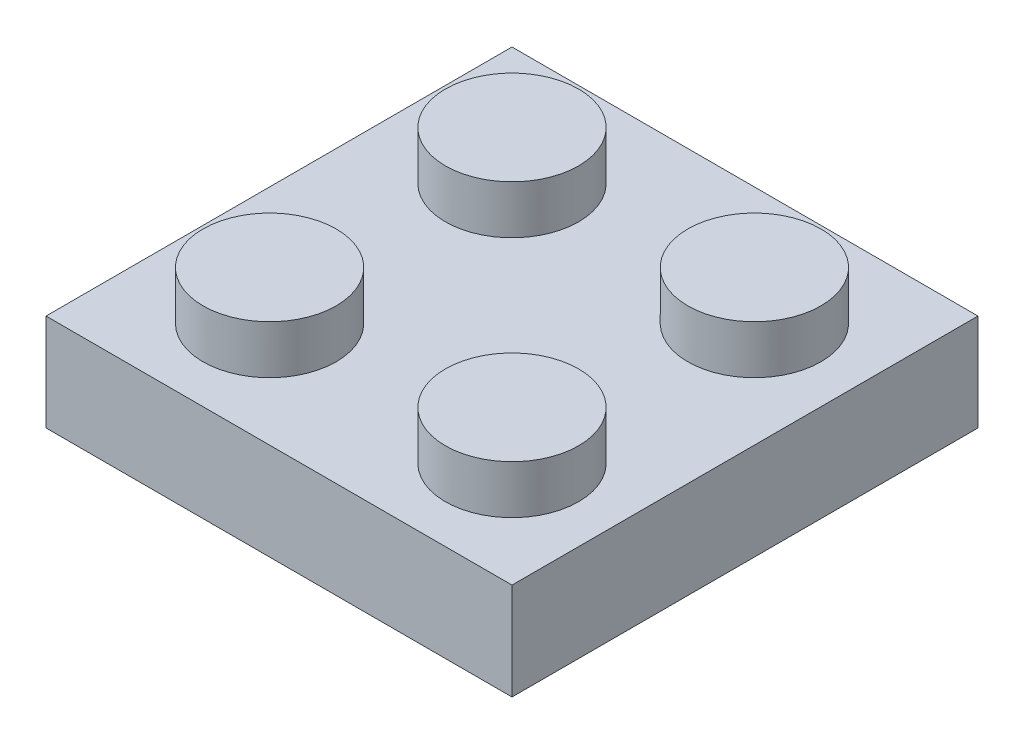
ISO-10303-21;
HEADER;
FILE_DESCRIPTION(('STEP AP214'),'2;1');
FILE_NAME('part.step','',(''),(''),'','','');
FILE_SCHEMA(('AUTOMOTIVE_DESIGN { 1 0 10303 214 1 1 1 1 }'));
ENDSEC;
DATA;
#1=APPLICATION_CONTEXT('core data for automotive mechanical design processes');
#2=APPLICATION_PROTOCOL_DEFINITION('international standard','automotive_design',2000,#1);
#3=PRODUCT_CONTEXT('',#1,'mechanical');
#4=PRODUCT('Part','Part','',(#3));
#5=PRODUCT_RELATED_PRODUCT_CATEGORY('part','',(#4));
#6=PRODUCT_DEFINITION_FORMATION('','',#4);
#7=PRODUCT_DEFINITION_CONTEXT('part definition',#1,'design');
#8=PRODUCT_DEFINITION('design','',#6,#7);
#9=PRODUCT_DEFINITION_SHAPE('','',#8);
#10=(LENGTH_UNIT() NAMED_UNIT(*) SI_UNIT(.MILLI.,.METRE.));
#11=(NAMED_UNIT(*) PLANE_ANGLE_UNIT() SI_UNIT($,.RADIAN.));
#12=(NAMED_UNIT(*) SI_UNIT($,.STERADIAN.) SOLID_ANGLE_UNIT());
#13=UNCERTAINTY_MEASURE_WITH_UNIT(LENGTH_MEASURE(1.E-05),#10,'distance_accuracy_value','');
#14=(GEOMETRIC_REPRESENTATION_CONTEXT(3) GLOBAL_UNCERTAINTY_ASSIGNED_CONTEXT((#13)) GLOBAL_UNIT_ASSIGNED_CONTEXT((#10,
#11,#12)) REPRESENTATION_CONTEXT('',''));
#15=CARTESIAN_POINT('',(0.,0.,0.));
#16=DIRECTION('',(0.,0.,1.));
#17=DIRECTION('',(1.,0.,0.));
#18=AXIS2_PLACEMENT_3D('',#15,#16,#17);
#19=CARTESIAN_POINT('',(-4.79472906403941,-9.19238815542512,0.));
#20=DIRECTION('',(0.,1.,0.));
#21=DIRECTION('',(-1.,0.,0.));
#22=AXIS2_PLACEMENT_3D('',#19,#20,#21);
#23=CYLINDRICAL_SURFACE('',#22,3.25);
#24=CARTESIAN_POINT('',(-4.79472906403941,2.,0.));
#25=DIRECTION('',(0.,-1.,0.));
#26=DIRECTION('',(1.,0.,0.));
#27=AXIS2_PLACEMENT_3D('',#24,#25,#26);
#28=CIRCLE('',#27,3.25);
#29=CARTESIAN_POINT('',(-3.5985824304441,2.,-3.02187578019656));
#30=VERTEX_POINT('',#29);
#31=CARTESIAN_POINT('',(-7.81660484423598,2.,1.19614663359531));
#32=VERTEX_POINT('',#31);
#33=EDGE_CURVE('E214',#30,#32,#28,.T.);
#34=ORIENTED_EDGE('',*,*,#33,.T.);
#35=DIRECTION('',(0.,1.,0.));
#36=VECTOR('',#35,1.);
#37=CARTESIAN_POINT('',(-7.81660484423598,1.1,1.19614663359531));
#38=LINE('',#37,#36);
#39=CARTESIAN_POINT('',(-7.81660484423598,0.2,1.19614663359531));
#40=VERTEX_POINT('',#39);
#41=EDGE_CURVE('E411',#40,#32,#38,.T.);
#42=ORIENTED_EDGE('',*,*,#41,.F.);
#43=CARTESIAN_POINT('',(-4.79472906403941,0.200000000000001,0.));
#44=DIRECTION('',(0.,1.,0.));
#45=DIRECTION('',(0.,0.,1.));
#46=AXIS2_PLACEMENT_3D('',#43,#44,#45);
#47=CIRCLE('',#46,3.25);
#48=CARTESIAN_POINT('',(-3.5985824304441,0.2,-3.02187578019656));
#49=VERTEX_POINT('',#48);
#50=EDGE_CURVE('E171',#40,#49,#47,.T.);
#51=ORIENTED_EDGE('',*,*,#50,.T.);
#52=DIRECTION('',(0.,1.,0.));
#53=VECTOR('',#52,1.);
#54=CARTESIAN_POINT('',(-3.5985824304441,1.1,-3.02187578019657));
#55=LINE('',#54,#53);
#56=EDGE_CURVE('E190',#30,#49,#55,.F.);
#57=ORIENTED_EDGE('',*,*,#56,.F.);
#58=EDGE_LOOP('',(#34,#42,#51,#57));
#59=FACE_BOUND('',#58,.T.);
#60=ADVANCED_FACE('F53',(#59),#23,.T.);
#61=CARTESIAN_POINT('',(-12.4847290640394,0.,7.69));
#62=DIRECTION('',(0.,1.,0.));
#63=DIRECTION('',(0.,0.,1.));
#64=AXIS2_PLACEMENT_3D('',#61,#62,#63);
#65=PLANE('',#64);
#66=DIRECTION('',(1.,0.,0.));
#67=VECTOR('',#66,1.);
#68=CARTESIAN_POINT('',(-12.4847290640394,0.,-7.69));
#69=LINE('',#68,#67);
#70=CARTESIAN_POINT('',(-12.4847290640394,0.,-7.69));
#71=VERTEX_POINT('',#70);
#72=CARTESIAN_POINT('',(2.89527093596059,0.,-7.69));
#73=VERTEX_POINT('',#72);
#74=EDGE_CURVE('E296',#71,#73,#69,.T.);
#75=ORIENTED_EDGE('',*,*,#74,.T.);
#76=DIRECTION('',(0.,0.,-1.));
#77=VECTOR('',#76,1.);
#78=CARTESIAN_POINT('',(2.89527093596059,0.,7.69));
#79=LINE('',#78,#77);
#80=CARTESIAN_POINT('',(2.89527093596059,0.,7.69));
#81=VERTEX_POINT('',#80);
#82=EDGE_CURVE('E306',#81,#73,#79,.T.);
#83=ORIENTED_EDGE('',*,*,#82,.F.);
#84=DIRECTION('',(1.,0.,0.));
#85=VECTOR('',#84,1.);
#86=CARTESIAN_POINT('',(-12.4847290640394,0.,7.69));
#87=LINE('',#86,#85);
#88=CARTESIAN_POINT('',(-12.4847290640394,0.,7.69));
#89=VERTEX_POINT('',#88);
#90=EDGE_CURVE('E286',#89,#81,#87,.T.);
#91=ORIENTED_EDGE('',*,*,#90,.F.);
#92=DIRECTION('',(0.,0.,-1.));
#93=VECTOR('',#92,1.);
#94=CARTESIAN_POINT('',(-12.4847290640394,0.,7.69));
#95=LINE('',#94,#93);
#96=EDGE_CURVE('E309',#89,#71,#95,.T.);
#97=ORIENTED_EDGE('',*,*,#96,.T.);
#98=EDGE_LOOP('',(#75,#83,#91,#97));
#99=FACE_BOUND('',#98,.T.);
#100=DIRECTION('',(1.,0.,0.));
#101=VECTOR('',#100,1.);
#102=CARTESIAN_POINT('',(-12.4847290640394,0.,-6.49));
#103=LINE('',#102,#101);
#104=CARTESIAN_POINT('',(-11.2847290640394,0.,-6.49));
#105=VERTEX_POINT('',#104);
#106=CARTESIAN_POINT('',(1.69527093596059,0.,-6.49));
#107=VERTEX_POINT('',#106);
#108=EDGE_CURVE('E261',#105,#107,#103,.T.);
#109=ORIENTED_EDGE('',*,*,#108,.F.);
#110=DIRECTION('',(0.,0.,-1.));
#111=VECTOR('',#110,1.);
#112=CARTESIAN_POINT('',(-11.2847290640394,0.,7.69));
#113=LINE('',#112,#111);
#114=CARTESIAN_POINT('',(-11.2847290640394,0.,6.49));
#115=VERTEX_POINT('',#114);
#116=EDGE_CURVE('E239',#115,#105,#113,.T.);
#117=ORIENTED_EDGE('',*,*,#116,.F.);
#118=DIRECTION('',(1.,0.,0.));
#119=VECTOR('',#118,1.);
#120=CARTESIAN_POINT('',(-12.4847290640394,0.,6.49));
#121=LINE('',#120,#119);
#122=CARTESIAN_POINT('',(1.69527093596059,0.,6.49));
#123=VERTEX_POINT('',#122);
#124=EDGE_CURVE('E264',#115,#123,#121,.T.);
#125=ORIENTED_EDGE('',*,*,#124,.T.);
#126=DIRECTION('',(0.,0.,-1.));
#127=VECTOR('',#126,1.);
#128=CARTESIAN_POINT('',(1.69527093596059,0.,7.69));
#129=LINE('',#128,#127);
#130=EDGE_CURVE('E253',#123,#107,#129,.T.);
#131=ORIENTED_EDGE('',*,*,#130,.T.);
#132=EDGE_LOOP('',(#109,#117,#125,#131));
#133=FACE_BOUND('',#132,.T.);
#134=ADVANCED_FACE('F358',(#99,#133),#65,.F.);
#135=CARTESIAN_POINT('',(-0.584729064039415,4.8,4.21));
#136=DIRECTION('',(0.,1.,0.));
#137=DIRECTION('',(-1.,0.,0.));
#138=AXIS2_PLACEMENT_3D('',#135,#136,#137);
#139=PLANE('',#138);
#140=CARTESIAN_POINT('',(-0.584729064039415,4.8,4.21));
#141=DIRECTION('',(0.,1.,0.));
#142=DIRECTION('',(-1.,0.,0.));
#143=AXIS2_PLACEMENT_3D('',#140,#141,#142);
#144=CIRCLE('',#143,2.19793866498286);
#145=CARTESIAN_POINT('',(-2.78266772902228,4.8,4.21));
#146=VERTEX_POINT('',#145);
#147=EDGE_CURVE('E61',#146,#146,#144,.T.);
#148=ORIENTED_EDGE('',*,*,#147,.T.);
#149=EDGE_LOOP('',(#148));
#150=FACE_BOUND('',#149,.T.);
#151=ADVANCED_FACE('F55',(#150),#139,.T.);
#152=CARTESIAN_POINT('',(-0.584729064039415,4.8,4.21));
#153=DIRECTION('',(0.,-1.,0.));
#154=DIRECTION('',(1.,0.,0.));
#155=AXIS2_PLACEMENT_3D('',#152,#153,#154);
#156=CYLINDRICAL_SURFACE('',#155,2.19793866498286);
#157=ORIENTED_EDGE('',*,*,#147,.F.);
#158=EDGE_LOOP('',(#157));
#159=FACE_BOUND('',#158,.T.);
#160=CARTESIAN_POINT('',(-0.584729064039415,3.2,4.21));
#161=DIRECTION('',(0.,-1.,0.));
#162=DIRECTION('',(1.,0.,0.));
#163=AXIS2_PLACEMENT_3D('',#160,#161,#162);
#164=CIRCLE('',#163,2.19793866498286);
#165=CARTESIAN_POINT('',(1.61320960094345,3.2,4.21));
#166=VERTEX_POINT('',#165);
#167=EDGE_CURVE('E324',#166,#166,#164,.F.);
#168=ORIENTED_EDGE('',*,*,#167,.T.);
#169=EDGE_LOOP('',(#168));
#170=FACE_BOUND('',#169,.T.);
#171=ADVANCED_FACE('F330',(#159,#170),#156,.T.);
#172=CARTESIAN_POINT('',(-8.58472906403941,4.8,4.21));
#173=DIRECTION('',(0.,1.,0.));
#174=DIRECTION('',(-1.,0.,0.));
#175=AXIS2_PLACEMENT_3D('',#172,#173,#174);
#176=PLANE('',#175);
#177=CARTESIAN_POINT('',(-8.58472906403941,4.8,4.21));
#178=DIRECTION('',(0.,1.,0.));
#179=DIRECTION('',(-1.,0.,0.));
#180=AXIS2_PLACEMENT_3D('',#177,#178,#179);
#181=CIRCLE('',#180,2.19793866498286);
#182=CARTESIAN_POINT('',(-10.7826677290223,4.8,4.21));
#183=VERTEX_POINT('',#182);
#184=EDGE_CURVE('E321',#183,#183,#181,.T.);
#185=ORIENTED_EDGE('',*,*,#184,.T.);
#186=EDGE_LOOP('',(#185));
#187=FACE_BOUND('',#186,.T.);
#188=ADVANCED_FACE('F333',(#187),#176,.T.);
#189=CARTESIAN_POINT('',(-8.58472906403941,4.8,4.21));
#190=DIRECTION('',(0.,-1.,0.));
#191=DIRECTION('',(1.,0.,0.));
#192=AXIS2_PLACEMENT_3D('',#189,#190,#191);
#193=CYLINDRICAL_SURFACE('',#192,2.19793866498286);
#194=ORIENTED_EDGE('',*,*,#184,.F.);
#195=EDGE_LOOP('',(#194));
#196=FACE_BOUND('',#195,.T.);
#197=CARTESIAN_POINT('',(-8.58472906403941,3.2,4.21));
#198=DIRECTION('',(0.,-1.,0.));
#199=DIRECTION('',(1.,0.,0.));
#200=AXIS2_PLACEMENT_3D('',#197,#198,#199);
#201=CIRCLE('',#200,2.19793866498286);
#202=CARTESIAN_POINT('',(-6.38679039905655,3.2,4.21));
#203=VERTEX_POINT('',#202);
#204=EDGE_CURVE('E318',#203,#203,#201,.F.);
#205=ORIENTED_EDGE('',*,*,#204,.T.);
#206=EDGE_LOOP('',(#205));
#207=FACE_BOUND('',#206,.T.);
#208=ADVANCED_FACE('F762',(#196,#207),#193,.T.);
#209=CARTESIAN_POINT('',(-12.4847290640394,3.2,7.69));
#210=DIRECTION('',(1.,0.,0.));
#211=DIRECTION('',(0.,0.,-1.));
#212=AXIS2_PLACEMENT_3D('',#209,#210,#211);
#213=PLANE('',#212);
#214=DIRECTION('',(0.,-1.,0.));
#215=VECTOR('',#214,1.);
#216=CARTESIAN_POINT('',(-12.4847290640394,3.2,-7.69));
#217=LINE('',#216,#215);
#218=CARTESIAN_POINT('',(-12.4847290640394,3.2,-7.69));
#219=VERTEX_POINT('',#218);
#220=EDGE_CURVE('E282',#219,#71,#217,.T.);
#221=ORIENTED_EDGE('',*,*,#220,.T.);
#222=ORIENTED_EDGE('',*,*,#96,.F.);
#223=DIRECTION('',(0.,-1.,0.));
#224=VECTOR('',#223,1.);
#225=CARTESIAN_POINT('',(-12.4847290640394,3.2,7.69));
#226=LINE('',#225,#224);
#227=CARTESIAN_POINT('',(-12.4847290640394,3.2,7.69));
#228=VERTEX_POINT('',#227);
#229=EDGE_CURVE('E283',#228,#89,#226,.T.);
#230=ORIENTED_EDGE('',*,*,#229,.F.);
#231=DIRECTION('',(0.,0.,-1.));
#232=VECTOR('',#231,1.);
#233=CARTESIAN_POINT('',(-12.4847290640394,3.2,7.69));
#234=LINE('',#233,#232);
#235=EDGE_CURVE('E293',#228,#219,#234,.T.);
#236=ORIENTED_EDGE('',*,*,#235,.T.);
#237=EDGE_LOOP('',(#221,#222,#230,#236));
#238=FACE_BOUND('',#237,.T.);
#239=ADVANCED_FACE('F351',(#238),#213,.F.);
#240=CARTESIAN_POINT('',(2.89527093596059,0.,7.69));
#241=DIRECTION('',(-1.,0.,0.));
#242=DIRECTION('',(0.,0.,1.));
#243=AXIS2_PLACEMENT_3D('',#240,#241,#242);
#244=PLANE('',#243);
#245=DIRECTION('',(0.,1.,0.));
#246=VECTOR('',#245,1.);
#247=CARTESIAN_POINT('',(2.89527093596059,0.,-7.69));
#248=LINE('',#247,#246);
#249=CARTESIAN_POINT('',(2.89527093596059,3.2,-7.69));
#250=VERTEX_POINT('',#249);
#251=EDGE_CURVE('E298',#73,#250,#248,.T.);
#252=ORIENTED_EDGE('',*,*,#251,.T.);
#253=DIRECTION('',(0.,0.,-1.));
#254=VECTOR('',#253,1.);
#255=CARTESIAN_POINT('',(2.89527093596059,3.2,7.69));
#256=LINE('',#255,#254);
#257=CARTESIAN_POINT('',(2.89527093596059,3.2,7.69));
#258=VERTEX_POINT('',#257);
#259=EDGE_CURVE('E303',#258,#250,#256,.T.);
#260=ORIENTED_EDGE('',*,*,#259,.F.);
#261=DIRECTION('',(0.,1.,0.));
#262=VECTOR('',#261,1.);
#263=CARTESIAN_POINT('',(2.89527093596059,0.,7.69));
#264=LINE('',#263,#262);
#265=EDGE_CURVE('E289',#81,#258,#264,.T.);
#266=ORIENTED_EDGE('',*,*,#265,.F.);
#267=ORIENTED_EDGE('',*,*,#82,.T.);
#268=EDGE_LOOP('',(#252,#260,#266,#267));
#269=FACE_BOUND('',#268,.T.);
#270=ADVANCED_FACE('F339',(#269),#244,.F.);
#271=CARTESIAN_POINT('',(2.89527093596059,3.2,7.69));
#272=DIRECTION('',(0.,-1.,0.));
#273=DIRECTION('',(1.,0.,0.));
#274=AXIS2_PLACEMENT_3D('',#271,#272,#273);
#275=PLANE('',#274);
#276=CARTESIAN_POINT('',(-0.584729064039415,3.2,-3.79));
#277=DIRECTION('',(0.,-1.,0.));
#278=DIRECTION('',(1.,0.,0.));
#279=AXIS2_PLACEMENT_3D('',#276,#277,#278);
#280=CIRCLE('',#279,2.19793866498286);
#281=CARTESIAN_POINT('',(1.61320960094345,3.2,-3.79));
#282=VERTEX_POINT('',#281);
#283=EDGE_CURVE('E315',#282,#282,#280,.F.);
#284=ORIENTED_EDGE('',*,*,#283,.F.);
#285=EDGE_LOOP('',(#284));
#286=FACE_BOUND('',#285,.T.);
#287=CARTESIAN_POINT('',(-8.58472906403941,3.2,-3.79));
#288=DIRECTION('',(0.,-1.,0.));
#289=DIRECTION('',(1.,0.,0.));
#290=AXIS2_PLACEMENT_3D('',#287,#288,#289);
#291=CIRCLE('',#290,2.19793866498286);
#292=CARTESIAN_POINT('',(-6.38679039905655,3.2,-3.79));
#293=VERTEX_POINT('',#292);
#294=EDGE_CURVE('E312',#293,#293,#291,.F.);
#295=ORIENTED_EDGE('',*,*,#294,.F.);
#296=EDGE_LOOP('',(#295));
#297=FACE_BOUND('',#296,.T.);
#298=DIRECTION('',(-1.,0.,0.));
#299=VECTOR('',#298,1.);
#300=CARTESIAN_POINT('',(2.89527093596059,3.2,-7.69));
#301=LINE('',#300,#299);
#302=EDGE_CURVE('E287',#250,#219,#301,.T.);
#303=ORIENTED_EDGE('',*,*,#302,.T.);
#304=ORIENTED_EDGE('',*,*,#235,.F.);
#305=DIRECTION('',(-1.,0.,0.));
#306=VECTOR('',#305,1.);
#307=CARTESIAN_POINT('',(2.89527093596059,3.2,7.69));
#308=LINE('',#307,#306);
#309=EDGE_CURVE('E291',#258,#228,#308,.T.);
#310=ORIENTED_EDGE('',*,*,#309,.F.);
#311=ORIENTED_EDGE('',*,*,#259,.T.);
#312=EDGE_LOOP('',(#303,#304,#310,#311));
#313=FACE_BOUND('',#312,.T.);
#314=ORIENTED_EDGE('',*,*,#204,.F.);
#315=EDGE_LOOP('',(#314));
#316=FACE_BOUND('',#315,.T.);
#317=ORIENTED_EDGE('',*,*,#167,.F.);
#318=EDGE_LOOP('',(#317));
#319=FACE_BOUND('',#318,.T.);
#320=ADVANCED_FACE('F336',(#286,#297,#313,#316,#319),#275,.F.);
#321=CARTESIAN_POINT('',(0.,0.,7.69));
#322=DIRECTION('',(0.,0.,1.));
#323=DIRECTION('',(1.,0.,0.));
#324=AXIS2_PLACEMENT_3D('',#321,#322,#323);
#325=PLANE('',#324);
#326=ORIENTED_EDGE('',*,*,#229,.T.);
#327=ORIENTED_EDGE('',*,*,#90,.T.);
#328=ORIENTED_EDGE('',*,*,#265,.T.);
#329=ORIENTED_EDGE('',*,*,#309,.T.);
#330=EDGE_LOOP('',(#326,#327,#328,#329));
#331=FACE_BOUND('',#330,.T.);
#332=ADVANCED_FACE('F338',(#331),#325,.T.);
#333=CARTESIAN_POINT('',(0.,0.,-7.69));
#334=DIRECTION('',(0.,0.,1.));
#335=DIRECTION('',(1.,0.,0.));
#336=AXIS2_PLACEMENT_3D('',#333,#334,#335);
#337=PLANE('',#336);
#338=ORIENTED_EDGE('',*,*,#220,.F.);
#339=ORIENTED_EDGE('',*,*,#302,.F.);
#340=ORIENTED_EDGE('',*,*,#251,.F.);
#341=ORIENTED_EDGE('',*,*,#74,.F.);
#342=EDGE_LOOP('',(#338,#339,#340,#341));
#343=FACE_BOUND('',#342,.T.);
#344=ADVANCED_FACE('F347',(#343),#337,.F.);
#345=CARTESIAN_POINT('',(-8.58472906403941,4.8,-3.79));
#346=DIRECTION('',(0.,-1.,0.));
#347=DIRECTION('',(1.,0.,0.));
#348=AXIS2_PLACEMENT_3D('',#345,#346,#347);
#349=CYLINDRICAL_SURFACE('',#348,2.19793866498286);
#350=CARTESIAN_POINT('',(-8.58472906403941,4.8,-3.79));
#351=DIRECTION('',(0.,1.,0.));
#352=DIRECTION('',(-1.,0.,0.));
#353=AXIS2_PLACEMENT_3D('',#350,#351,#352);
#354=CIRCLE('',#353,2.19793866498286);
#355=CARTESIAN_POINT('',(-10.7826677290223,4.8,-3.79));
#356=VERTEX_POINT('',#355);
#357=EDGE_CURVE('E279',#356,#356,#354,.T.);
#358=ORIENTED_EDGE('',*,*,#357,.F.);
#359=EDGE_LOOP('',(#358));
#360=FACE_BOUND('',#359,.T.);
#361=ORIENTED_EDGE('',*,*,#294,.T.);
#362=EDGE_LOOP('',(#361));
#363=FACE_BOUND('',#362,.T.);
#364=ADVANCED_FACE('F522',(#360,#363),#349,.T.);
#365=CARTESIAN_POINT('',(-8.58472906403941,4.8,-3.79));
#366=DIRECTION('',(0.,1.,0.));
#367=DIRECTION('',(-1.,0.,0.));
#368=AXIS2_PLACEMENT_3D('',#365,#366,#367);
#369=PLANE('',#368);
#370=ORIENTED_EDGE('',*,*,#357,.T.);
#371=EDGE_LOOP('',(#370));
#372=FACE_BOUND('',#371,.T.);
#373=ADVANCED_FACE('F515',(#372),#369,.T.);
#374=CARTESIAN_POINT('',(-0.584729064039415,4.8,-3.79));
#375=DIRECTION('',(0.,-1.,0.));
#376=DIRECTION('',(1.,0.,0.));
#377=AXIS2_PLACEMENT_3D('',#374,#375,#376);
#378=CYLINDRICAL_SURFACE('',#377,2.19793866498286);
#379=CARTESIAN_POINT('',(-0.584729064039415,4.8,-3.79));
#380=DIRECTION('',(0.,1.,0.));
#381=DIRECTION('',(-1.,0.,0.));
#382=AXIS2_PLACEMENT_3D('',#379,#380,#381);
#383=CIRCLE('',#382,2.19793866498286);
#384=CARTESIAN_POINT('',(-2.78266772902228,4.8,-3.79));
#385=VERTEX_POINT('',#384);
#386=EDGE_CURVE('E227',#385,#385,#383,.T.);
#387=ORIENTED_EDGE('',*,*,#386,.F.);
#388=EDGE_LOOP('',(#387));
#389=FACE_BOUND('',#388,.T.);
#390=ORIENTED_EDGE('',*,*,#283,.T.);
#391=EDGE_LOOP('',(#390));
#392=FACE_BOUND('',#391,.T.);
#393=ADVANCED_FACE('F506',(#389,#392),#378,.T.);
#394=CARTESIAN_POINT('',(-0.584729064039415,4.8,-3.79));
#395=DIRECTION('',(0.,1.,0.));
#396=DIRECTION('',(-1.,0.,0.));
#397=AXIS2_PLACEMENT_3D('',#394,#395,#396);
#398=PLANE('',#397);
#399=ORIENTED_EDGE('',*,*,#386,.T.);
#400=EDGE_LOOP('',(#399));
#401=FACE_BOUND('',#400,.T.);
#402=ADVANCED_FACE('F501',(#401),#398,.T.);
#403=CARTESIAN_POINT('',(-0.584729064039415,3.6,4.21));
#404=DIRECTION('',(0.,1.,0.));
#405=DIRECTION('',(-1.,0.,0.));
#406=AXIS2_PLACEMENT_3D('',#403,#404,#405);
#407=PLANE('',#406);
#408=CARTESIAN_POINT('',(-0.584729064039415,3.6,4.21));
#409=DIRECTION('',(0.,1.,0.));
#410=DIRECTION('',(-1.,0.,0.));
#411=AXIS2_PLACEMENT_3D('',#408,#409,#410);
#412=CIRCLE('',#411,0.997938664982861);
#413=CARTESIAN_POINT('',(-1.58266772902228,3.6,4.21));
#414=VERTEX_POINT('',#413);
#415=EDGE_CURVE('E224',#414,#414,#412,.T.);
#416=ORIENTED_EDGE('',*,*,#415,.F.);
#417=EDGE_LOOP('',(#416));
#418=FACE_BOUND('',#417,.T.);
#419=ADVANCED_FACE('F498',(#418),#407,.F.);
#420=CARTESIAN_POINT('',(-0.584729064039415,4.8,4.21));
#421=DIRECTION('',(0.,-1.,0.));
#422=DIRECTION('',(1.,0.,0.));
#423=AXIS2_PLACEMENT_3D('',#420,#421,#422);
#424=CYLINDRICAL_SURFACE('',#423,0.997938664982861);
#425=ORIENTED_EDGE('',*,*,#415,.T.);
#426=EDGE_LOOP('',(#425));
#427=FACE_BOUND('',#426,.T.);
#428=CARTESIAN_POINT('',(-0.584729064039415,2.,4.21));
#429=DIRECTION('',(0.,-1.,0.));
#430=DIRECTION('',(1.,0.,0.));
#431=AXIS2_PLACEMENT_3D('',#428,#429,#430);
#432=CIRCLE('',#431,0.997938664982861);
#433=CARTESIAN_POINT('',(0.413209600943446,2.,4.21));
#434=VERTEX_POINT('',#433);
#435=EDGE_CURVE('E228',#434,#434,#432,.F.);
#436=ORIENTED_EDGE('',*,*,#435,.F.);
#437=EDGE_LOOP('',(#436));
#438=FACE_BOUND('',#437,.T.);
#439=ADVANCED_FACE('F494',(#427,#438),#424,.F.);
#440=CARTESIAN_POINT('',(-8.58472906403941,3.6,4.21));
#441=DIRECTION('',(0.,1.,0.));
#442=DIRECTION('',(-1.,0.,0.));
#443=AXIS2_PLACEMENT_3D('',#440,#441,#442);
#444=PLANE('',#443);
#445=CARTESIAN_POINT('',(-8.58472906403941,3.6,4.21));
#446=DIRECTION('',(0.,1.,0.));
#447=DIRECTION('',(-1.,0.,0.));
#448=AXIS2_PLACEMENT_3D('',#445,#446,#447);
#449=CIRCLE('',#448,0.997938664982861);
#450=CARTESIAN_POINT('',(-9.58266772902228,3.6,4.21));
#451=VERTEX_POINT('',#450);
#452=EDGE_CURVE('E231',#451,#451,#449,.T.);
#453=ORIENTED_EDGE('',*,*,#452,.F.);
#454=EDGE_LOOP('',(#453));
#455=FACE_BOUND('',#454,.T.);
#456=ADVANCED_FACE('F490',(#455),#444,.F.);
#457=CARTESIAN_POINT('',(-8.58472906403941,4.8,4.21));
#458=DIRECTION('',(0.,-1.,0.));
#459=DIRECTION('',(1.,0.,0.));
#460=AXIS2_PLACEMENT_3D('',#457,#458,#459);
#461=CYLINDRICAL_SURFACE('',#460,0.997938664982861);
#462=ORIENTED_EDGE('',*,*,#452,.T.);
#463=EDGE_LOOP('',(#462));
#464=FACE_BOUND('',#463,.T.);
#465=CARTESIAN_POINT('',(-8.58472906403941,2.,4.21));
#466=DIRECTION('',(0.,-1.,0.));
#467=DIRECTION('',(1.,0.,0.));
#468=AXIS2_PLACEMENT_3D('',#465,#466,#467);
#469=CIRCLE('',#468,0.997938664982861);
#470=CARTESIAN_POINT('',(-7.58679039905655,2.,4.21));
#471=VERTEX_POINT('',#470);
#472=EDGE_CURVE('E235',#471,#471,#469,.F.);
#473=ORIENTED_EDGE('',*,*,#472,.F.);
#474=EDGE_LOOP('',(#473));
#475=FACE_BOUND('',#474,.T.);
#476=ADVANCED_FACE('F483',(#464,#475),#461,.F.);
#477=CARTESIAN_POINT('',(-11.2847290640394,3.2,7.69));
#478=DIRECTION('',(1.,0.,0.));
#479=DIRECTION('',(0.,0.,-1.));
#480=AXIS2_PLACEMENT_3D('',#477,#478,#479);
#481=PLANE('',#480);
#482=DIRECTION('',(0.,-1.,0.));
#483=VECTOR('',#482,1.);
#484=CARTESIAN_POINT('',(-11.2847290640394,3.2,-6.49));
#485=LINE('',#484,#483);
#486=CARTESIAN_POINT('',(-11.2847290640394,2.,-6.49));
#487=VERTEX_POINT('',#486);
#488=EDGE_CURVE('E258',#487,#105,#485,.T.);
#489=ORIENTED_EDGE('',*,*,#488,.F.);
#490=DIRECTION('',(0.,0.,-1.));
#491=VECTOR('',#490,1.);
#492=CARTESIAN_POINT('',(-11.2847290640394,2.,7.69));
#493=LINE('',#492,#491);
#494=CARTESIAN_POINT('',(-11.2847290640394,2.,6.49));
#495=VERTEX_POINT('',#494);
#496=EDGE_CURVE('E244',#495,#487,#493,.T.);
#497=ORIENTED_EDGE('',*,*,#496,.F.);
#498=DIRECTION('',(0.,-1.,0.));
#499=VECTOR('',#498,1.);
#500=CARTESIAN_POINT('',(-11.2847290640394,3.2,6.49));
#501=LINE('',#500,#499);
#502=EDGE_CURVE('E242',#495,#115,#501,.T.);
#503=ORIENTED_EDGE('',*,*,#502,.T.);
#504=ORIENTED_EDGE('',*,*,#116,.T.);
#505=EDGE_LOOP('',(#489,#497,#503,#504));
#506=FACE_BOUND('',#505,.T.);
#507=ADVANCED_FACE('F478',(#506),#481,.T.);
#508=CARTESIAN_POINT('',(1.69527093596059,0.,7.69));
#509=DIRECTION('',(-1.,0.,0.));
#510=DIRECTION('',(0.,0.,1.));
#511=AXIS2_PLACEMENT_3D('',#508,#509,#510);
#512=PLANE('',#511);
#513=DIRECTION('',(0.,1.,0.));
#514=VECTOR('',#513,1.);
#515=CARTESIAN_POINT('',(1.69527093596059,0.,-6.49));
#516=LINE('',#515,#514);
#517=CARTESIAN_POINT('',(1.69527093596059,2.,-6.49));
#518=VERTEX_POINT('',#517);
#519=EDGE_CURVE('E243',#107,#518,#516,.T.);
#520=ORIENTED_EDGE('',*,*,#519,.F.);
#521=ORIENTED_EDGE('',*,*,#130,.F.);
#522=DIRECTION('',(0.,1.,0.));
#523=VECTOR('',#522,1.);
#524=CARTESIAN_POINT('',(1.69527093596059,0.,6.49));
#525=LINE('',#524,#523);
#526=CARTESIAN_POINT('',(1.69527093596059,2.,6.49));
#527=VERTEX_POINT('',#526);
#528=EDGE_CURVE('E250',#123,#527,#525,.T.);
#529=ORIENTED_EDGE('',*,*,#528,.T.);
#530=DIRECTION('',(0.,0.,-1.));
#531=VECTOR('',#530,1.);
#532=CARTESIAN_POINT('',(1.69527093596059,2.,7.69));
#533=LINE('',#532,#531);
#534=EDGE_CURVE('E247',#527,#518,#533,.T.);
#535=ORIENTED_EDGE('',*,*,#534,.T.);
#536=EDGE_LOOP('',(#520,#521,#529,#535));
#537=FACE_BOUND('',#536,.T.);
#538=ADVANCED_FACE('F471',(#537),#512,.T.);
#539=CARTESIAN_POINT('',(2.89527093596059,2.,7.69));
#540=DIRECTION('',(0.,-1.,0.));
#541=DIRECTION('',(1.,0.,0.));
#542=AXIS2_PLACEMENT_3D('',#539,#540,#541);
#543=PLANE('',#542);
#544=CARTESIAN_POINT('',(-8.58472906403941,2.,0.21));
#545=DIRECTION('',(0.,-1.,0.));
#546=DIRECTION('',(1.,0.,0.));
#547=AXIS2_PLACEMENT_3D('',#544,#545,#546);
#548=CIRCLE('',#547,1.25);
#549=CARTESIAN_POINT('',(-7.93025517998532,2.,-0.854971330642824));
#550=VERTEX_POINT('',#549);
#551=EDGE_CURVE('E179',#550,#32,#548,.F.);
#552=ORIENTED_EDGE('',*,*,#551,.T.);
#553=ORIENTED_EDGE('',*,*,#33,.F.);
#554=CARTESIAN_POINT('',(-4.58472906403941,2.,-3.79));
#555=DIRECTION('',(0.,-1.,0.));
#556=DIRECTION('',(1.,0.,0.));
#557=AXIS2_PLACEMENT_3D('',#554,#555,#556);
#558=CIRCLE('',#557,1.25);
#559=CARTESIAN_POINT('',(-5.64970039468224,2.,-3.13552611594591));
#560=VERTEX_POINT('',#559);
#561=EDGE_CURVE('E194',#30,#560,#558,.F.);
#562=ORIENTED_EDGE('',*,*,#561,.T.);
#563=EDGE_CURVE('E217',#550,#560,#28,.T.);
#564=ORIENTED_EDGE('',*,*,#563,.F.);
#565=EDGE_LOOP('',(#552,#553,#562,#564));
#566=FACE_BOUND('',#565,.T.);
#567=CARTESIAN_POINT('',(-0.584729064039415,2.,-3.79));
#568=DIRECTION('',(0.,-1.,0.));
#569=DIRECTION('',(1.,0.,0.));
#570=AXIS2_PLACEMENT_3D('',#567,#568,#569);
#571=CIRCLE('',#570,0.997938664982861);
#572=CARTESIAN_POINT('',(0.413209600943446,2.,-3.79));
#573=VERTEX_POINT('',#572);
#574=EDGE_CURVE('E232',#573,#573,#571,.F.);
#575=ORIENTED_EDGE('',*,*,#574,.T.);
#576=EDGE_LOOP('',(#575));
#577=FACE_BOUND('',#576,.T.);
#578=CARTESIAN_POINT('',(-8.58472906403941,2.,-3.79));
#579=DIRECTION('',(0.,-1.,0.));
#580=DIRECTION('',(1.,0.,0.));
#581=AXIS2_PLACEMENT_3D('',#578,#579,#580);
#582=CIRCLE('',#581,0.997938664982861);
#583=CARTESIAN_POINT('',(-7.58679039905655,2.,-3.79));
#584=VERTEX_POINT('',#583);
#585=EDGE_CURVE('E236',#584,#584,#582,.F.);
#586=ORIENTED_EDGE('',*,*,#585,.T.);
#587=EDGE_LOOP('',(#586));
#588=FACE_BOUND('',#587,.T.);
#589=DIRECTION('',(-1.,0.,0.));
#590=VECTOR('',#589,1.);
#591=CARTESIAN_POINT('',(2.89527093596059,2.,-6.49));
#592=LINE('',#591,#590);
#593=EDGE_CURVE('E240',#518,#487,#592,.T.);
#594=ORIENTED_EDGE('',*,*,#593,.F.);
#595=ORIENTED_EDGE('',*,*,#534,.F.);
#596=DIRECTION('',(-1.,0.,0.));
#597=VECTOR('',#596,1.);
#598=CARTESIAN_POINT('',(2.89527093596059,2.,6.49));
#599=LINE('',#598,#597);
#600=EDGE_CURVE('E248',#527,#495,#599,.T.);
#601=ORIENTED_EDGE('',*,*,#600,.T.);
#602=ORIENTED_EDGE('',*,*,#496,.T.);
#603=EDGE_LOOP('',(#594,#595,#601,#602));
#604=FACE_BOUND('',#603,.T.);
#605=ORIENTED_EDGE('',*,*,#472,.T.);
#606=EDGE_LOOP('',(#605));
#607=FACE_BOUND('',#606,.T.);
#608=ORIENTED_EDGE('',*,*,#435,.T.);
#609=EDGE_LOOP('',(#608));
#610=FACE_BOUND('',#609,.T.);
#611=ADVANCED_FACE('F383',(#566,#577,#588,#604,#607,#610),#543,.T.);
#612=CARTESIAN_POINT('',(0.,0.,6.49));
#613=DIRECTION('',(0.,0.,1.));
#614=DIRECTION('',(1.,0.,0.));
#615=AXIS2_PLACEMENT_3D('',#612,#613,#614);
#616=PLANE('',#615);
#617=ORIENTED_EDGE('',*,*,#502,.F.);
#618=ORIENTED_EDGE('',*,*,#600,.F.);
#619=ORIENTED_EDGE('',*,*,#528,.F.);
#620=ORIENTED_EDGE('',*,*,#124,.F.);
#621=EDGE_LOOP('',(#617,#618,#619,#620));
#622=FACE_BOUND('',#621,.T.);
#623=ADVANCED_FACE('F470',(#622),#616,.F.);
#624=CARTESIAN_POINT('',(0.,0.,-6.49));
#625=DIRECTION('',(0.,0.,1.));
#626=DIRECTION('',(1.,0.,0.));
#627=AXIS2_PLACEMENT_3D('',#624,#625,#626);
#628=PLANE('',#627);
#629=ORIENTED_EDGE('',*,*,#488,.T.);
#630=ORIENTED_EDGE('',*,*,#108,.T.);
#631=ORIENTED_EDGE('',*,*,#519,.T.);
#632=ORIENTED_EDGE('',*,*,#593,.T.);
#633=EDGE_LOOP('',(#629,#630,#631,#632));
#634=FACE_BOUND('',#633,.T.);
#635=ADVANCED_FACE('F475',(#634),#628,.T.);
#636=CARTESIAN_POINT('',(-8.58472906403941,4.8,-3.79));
#637=DIRECTION('',(0.,-1.,0.));
#638=DIRECTION('',(1.,0.,0.));
#639=AXIS2_PLACEMENT_3D('',#636,#637,#638);
#640=CYLINDRICAL_SURFACE('',#639,0.997938664982861);
#641=CARTESIAN_POINT('',(-8.58472906403941,3.6,-3.79));
#642=DIRECTION('',(0.,1.,0.));
#643=DIRECTION('',(-1.,0.,0.));
#644=AXIS2_PLACEMENT_3D('',#641,#642,#643);
#645=CIRCLE('',#644,0.997938664982861);
#646=CARTESIAN_POINT('',(-9.58266772902228,3.6,-3.79));
#647=VERTEX_POINT('',#646);
#648=EDGE_CURVE('E262',#647,#647,#645,.T.);
#649=ORIENTED_EDGE('',*,*,#648,.T.);
#650=EDGE_LOOP('',(#649));
#651=FACE_BOUND('',#650,.T.);
#652=ORIENTED_EDGE('',*,*,#585,.F.);
#653=EDGE_LOOP('',(#652));
#654=FACE_BOUND('',#653,.T.);
#655=ADVANCED_FACE('F560',(#651,#654),#640,.F.);
#656=CARTESIAN_POINT('',(-8.58472906403941,3.6,-3.79));
#657=DIRECTION('',(0.,1.,0.));
#658=DIRECTION('',(-1.,0.,0.));
#659=AXIS2_PLACEMENT_3D('',#656,#657,#658);
#660=PLANE('',#659);
#661=ORIENTED_EDGE('',*,*,#648,.F.);
#662=EDGE_LOOP('',(#661));
#663=FACE_BOUND('',#662,.T.);
#664=ADVANCED_FACE('F565',(#663),#660,.F.);
#665=CARTESIAN_POINT('',(-0.584729064039415,4.8,-3.79));
#666=DIRECTION('',(0.,-1.,0.));
#667=DIRECTION('',(1.,0.,0.));
#668=AXIS2_PLACEMENT_3D('',#665,#666,#667);
#669=CYLINDRICAL_SURFACE('',#668,0.997938664982861);
#670=CARTESIAN_POINT('',(-0.584729064039415,3.6,-3.79));
#671=DIRECTION('',(0.,1.,0.));
#672=DIRECTION('',(-1.,0.,0.));
#673=AXIS2_PLACEMENT_3D('',#670,#671,#672);
#674=CIRCLE('',#673,0.997938664982861);
#675=CARTESIAN_POINT('',(-1.58266772902228,3.6,-3.79));
#676=VERTEX_POINT('',#675);
#677=EDGE_CURVE('E223',#676,#676,#674,.T.);
#678=ORIENTED_EDGE('',*,*,#677,.T.);
#679=EDGE_LOOP('',(#678));
#680=FACE_BOUND('',#679,.T.);
#681=ORIENTED_EDGE('',*,*,#574,.F.);
#682=EDGE_LOOP('',(#681));
#683=FACE_BOUND('',#682,.T.);
#684=ADVANCED_FACE('F397',(#680,#683),#669,.F.);
#685=CARTESIAN_POINT('',(-0.584729064039415,3.6,-3.79));
#686=DIRECTION('',(0.,1.,0.));
#687=DIRECTION('',(-1.,0.,0.));
#688=AXIS2_PLACEMENT_3D('',#685,#686,#687);
#689=PLANE('',#688);
#690=ORIENTED_EDGE('',*,*,#677,.F.);
#691=EDGE_LOOP('',(#690));
#692=FACE_BOUND('',#691,.T.);
#693=ADVANCED_FACE('F389',(#692),#689,.F.);
#694=CARTESIAN_POINT('',(-5.64970039468224,0.2,-3.13552611594591));
#695=VERTEX_POINT('',#694);
#696=CARTESIAN_POINT('',(-7.93025517998532,0.2,-0.854971330642824));
#697=VERTEX_POINT('',#696);
#698=EDGE_CURVE('E170',#695,#697,#47,.T.);
#699=ORIENTED_EDGE('',*,*,#698,.T.);
#700=DIRECTION('',(0.,1.,0.));
#701=VECTOR('',#700,1.);
#702=CARTESIAN_POINT('',(-7.93025517998532,1.1,-0.854971330642825));
#703=LINE('',#702,#701);
#704=EDGE_CURVE('E403',#550,#697,#703,.F.);
#705=ORIENTED_EDGE('',*,*,#704,.F.);
#706=ORIENTED_EDGE('',*,*,#563,.T.);
#707=DIRECTION('',(0.,1.,0.));
#708=VECTOR('',#707,1.);
#709=CARTESIAN_POINT('',(-5.64970039468224,1.1,-3.13552611594591));
#710=LINE('',#709,#708);
#711=EDGE_CURVE('E200',#695,#560,#710,.T.);
#712=ORIENTED_EDGE('',*,*,#711,.F.);
#713=EDGE_LOOP('',(#699,#705,#706,#712));
#714=FACE_BOUND('',#713,.T.);
#715=ADVANCED_FACE('F369',(#714),#23,.T.);
#716=CARTESIAN_POINT('',(-4.79472906403941,-9.19238815542512,0.));
#717=DIRECTION('',(0.,1.,0.));
#718=DIRECTION('',(-1.,0.,0.));
#719=AXIS2_PLACEMENT_3D('',#716,#717,#718);
#720=CYLINDRICAL_SURFACE('',#719,2.4);
#721=CARTESIAN_POINT('',(-4.79472906403941,0.200000000000001,0.));
#722=DIRECTION('',(0.,1.,0.));
#723=DIRECTION('',(0.,0.,1.));
#724=AXIS2_PLACEMENT_3D('',#721,#722,#723);
#725=CIRCLE('',#724,2.4);
#726=CARTESIAN_POINT('',(-4.79472906403941,0.200000000000001,2.4));
#727=VERTEX_POINT('',#726);
#728=EDGE_CURVE('E220',#727,#727,#725,.T.);
#729=ORIENTED_EDGE('',*,*,#728,.F.);
#730=EDGE_LOOP('',(#729));
#731=FACE_BOUND('',#730,.T.);
#732=CARTESIAN_POINT('',(-4.79472906403941,2.,0.));
#733=DIRECTION('',(0.,-1.,0.));
#734=DIRECTION('',(1.,0.,0.));
#735=AXIS2_PLACEMENT_3D('',#732,#733,#734);
#736=CIRCLE('',#735,2.4);
#737=CARTESIAN_POINT('',(-2.39472906403942,2.,0.));
#738=VERTEX_POINT('',#737);
#739=EDGE_CURVE('E13',#738,#738,#736,.F.);
#740=ORIENTED_EDGE('',*,*,#739,.T.);
#741=EDGE_LOOP('',(#740));
#742=FACE_BOUND('',#741,.T.);
#743=ADVANCED_FACE('F388',(#731,#742),#720,.F.);
#744=CARTESIAN_POINT('',(-12.4847290640394,0.2,7.69));
#745=DIRECTION('',(0.,1.,0.));
#746=DIRECTION('',(0.,0.,1.));
#747=AXIS2_PLACEMENT_3D('',#744,#745,#746);
#748=PLANE('',#747);
#749=ORIENTED_EDGE('',*,*,#728,.T.);
#750=EDGE_LOOP('',(#749));
#751=FACE_BOUND('',#750,.T.);
#752=ORIENTED_EDGE('',*,*,#50,.F.);
#753=CARTESIAN_POINT('',(-8.58472906403941,0.2,0.21));
#754=DIRECTION('',(0.,1.,0.));
#755=DIRECTION('',(0.,0.,1.));
#756=AXIS2_PLACEMENT_3D('',#753,#754,#755);
#757=CIRCLE('',#756,1.25);
#758=EDGE_CURVE('E184',#697,#40,#757,.F.);
#759=ORIENTED_EDGE('',*,*,#758,.F.);
#760=ORIENTED_EDGE('',*,*,#698,.F.);
#761=CARTESIAN_POINT('',(-4.58472906403941,0.2,-3.79));
#762=DIRECTION('',(0.,1.,0.));
#763=DIRECTION('',(0.,0.,1.));
#764=AXIS2_PLACEMENT_3D('',#761,#762,#763);
#765=CIRCLE('',#764,1.25);
#766=EDGE_CURVE('E203',#49,#695,#765,.F.);
#767=ORIENTED_EDGE('',*,*,#766,.F.);
#768=EDGE_LOOP('',(#752,#759,#760,#767));
#769=FACE_BOUND('',#768,.T.);
#770=ADVANCED_FACE('F385',(#751,#769),#748,.F.);
#771=ORIENTED_EDGE('',*,*,#739,.F.);
#772=EDGE_LOOP('',(#771));
#773=FACE_BOUND('',#772,.T.);
#774=ADVANCED_FACE('F450',(#773),#543,.T.);
#775=CARTESIAN_POINT('',(-4.58472906403941,0.,-3.79));
#776=DIRECTION('',(0.,-1.,0.));
#777=DIRECTION('',(0.,0.,-1.));
#778=AXIS2_PLACEMENT_3D('',#775,#776,#777);
#779=PLANE('',#778);
#780=CARTESIAN_POINT('',(-4.58472906403941,0.,-3.79));
#781=DIRECTION('',(0.,-1.,0.));
#782=DIRECTION('',(0.,0.,-1.));
#783=AXIS2_PLACEMENT_3D('',#780,#781,#782);
#784=CIRCLE('',#783,0.75);
#785=CARTESIAN_POINT('',(-4.58472906403941,0.,-4.54));
#786=VERTEX_POINT('',#785);
#787=EDGE_CURVE('E187',#786,#786,#784,.T.);
#788=ORIENTED_EDGE('',*,*,#787,.F.);
#789=EDGE_LOOP('',(#788));
#790=FACE_BOUND('',#789,.T.);
#791=CARTESIAN_POINT('',(-4.58472906403941,0.,-3.79));
#792=DIRECTION('',(0.,-1.,0.));
#793=DIRECTION('',(0.,0.,-1.));
#794=AXIS2_PLACEMENT_3D('',#791,#792,#793);
#795=CIRCLE('',#794,1.25);
#796=CARTESIAN_POINT('',(-4.58472906403941,0.,-5.04));
#797=VERTEX_POINT('',#796);
#798=EDGE_CURVE('E191',#797,#797,#795,.T.);
#799=ORIENTED_EDGE('',*,*,#798,.T.);
#800=EDGE_LOOP('',(#799));
#801=FACE_BOUND('',#800,.T.);
#802=ADVANCED_FACE('F442',(#790,#801),#779,.T.);
#803=CARTESIAN_POINT('',(-4.58472906403941,4.802,-3.79));
#804=DIRECTION('',(0.,-1.,0.));
#805=DIRECTION('',(0.,0.,-1.));
#806=AXIS2_PLACEMENT_3D('',#803,#804,#805);
#807=CYLINDRICAL_SURFACE('',#806,1.25);
#808=ORIENTED_EDGE('',*,*,#798,.F.);
#809=EDGE_LOOP('',(#808));
#810=FACE_BOUND('',#809,.T.);
#811=ORIENTED_EDGE('',*,*,#56,.T.);
#812=ORIENTED_EDGE('',*,*,#766,.T.);
#813=ORIENTED_EDGE('',*,*,#711,.T.);
#814=ORIENTED_EDGE('',*,*,#561,.F.);
#815=EDGE_LOOP('',(#811,#812,#813,#814));
#816=FACE_BOUND('',#815,.T.);
#817=ADVANCED_FACE('F439',(#810,#816),#807,.T.);
#818=CARTESIAN_POINT('',(-4.58472906403941,4.802,-3.79));
#819=DIRECTION('',(0.,-1.,0.));
#820=DIRECTION('',(0.,0.,-1.));
#821=AXIS2_PLACEMENT_3D('',#818,#819,#820);
#822=CYLINDRICAL_SURFACE('',#821,0.75);
#823=ORIENTED_EDGE('',*,*,#787,.T.);
#824=EDGE_LOOP('',(#823));
#825=FACE_BOUND('',#824,.T.);
#826=CARTESIAN_POINT('',(-4.58472906403941,0.2,-3.79));
#827=DIRECTION('',(0.,1.,0.));
#828=DIRECTION('',(0.,0.,1.));
#829=AXIS2_PLACEMENT_3D('',#826,#827,#828);
#830=CIRCLE('',#829,0.75);
#831=CARTESIAN_POINT('',(-4.14289474766906,0.200000000000001,-3.18396168695573));
#832=VERTEX_POINT('',#831);
#833=CARTESIAN_POINT('',(-5.0908130437959,0.2,-3.23648486431368));
#834=VERTEX_POINT('',#833);
#835=EDGE_CURVE('E208',#832,#834,#830,.F.);
#836=ORIENTED_EDGE('',*,*,#835,.F.);
#837=DIRECTION('',(0.,1.,0.));
#838=VECTOR('',#837,1.);
#839=CARTESIAN_POINT('',(-4.14289474766906,1.1,-3.18396168695573));
#840=LINE('',#839,#838);
#841=CARTESIAN_POINT('',(-4.14289474766906,2.,-3.18396168695573));
#842=VERTEX_POINT('',#841);
#843=EDGE_CURVE('E197',#842,#832,#840,.F.);
#844=ORIENTED_EDGE('',*,*,#843,.F.);
#845=CARTESIAN_POINT('',(-4.58472906403941,2.,-3.79));
#846=DIRECTION('',(0.,-1.,0.));
#847=DIRECTION('',(1.,0.,0.));
#848=AXIS2_PLACEMENT_3D('',#845,#846,#847);
#849=CIRCLE('',#848,0.75);
#850=CARTESIAN_POINT('',(-5.0908130437959,2.,-3.23648486431368));
#851=VERTEX_POINT('',#850);
#852=EDGE_CURVE('E205',#842,#851,#849,.F.);
#853=ORIENTED_EDGE('',*,*,#852,.T.);
#854=DIRECTION('',(0.,1.,0.));
#855=VECTOR('',#854,1.);
#856=CARTESIAN_POINT('',(-5.0908130437959,1.1,-3.23648486431368));
#857=LINE('',#856,#855);
#858=EDGE_CURVE('E211',#834,#851,#857,.T.);
#859=ORIENTED_EDGE('',*,*,#858,.F.);
#860=EDGE_LOOP('',(#836,#844,#853,#859));
#861=FACE_BOUND('',#860,.T.);
#862=ADVANCED_FACE('F441',(#825,#861),#822,.F.);
#863=ORIENTED_EDGE('',*,*,#835,.T.);
#864=EDGE_CURVE('E173',#832,#834,#47,.T.);
#865=ORIENTED_EDGE('',*,*,#864,.F.);
#866=EDGE_LOOP('',(#863,#865));
#867=FACE_BOUND('',#866,.T.);
#868=ADVANCED_FACE('F374',(#867),#748,.F.);
#869=ORIENTED_EDGE('',*,*,#858,.T.);
#870=EDGE_CURVE('E216',#851,#842,#28,.T.);
#871=ORIENTED_EDGE('',*,*,#870,.T.);
#872=ORIENTED_EDGE('',*,*,#843,.T.);
#873=ORIENTED_EDGE('',*,*,#864,.T.);
#874=EDGE_LOOP('',(#869,#871,#872,#873));
#875=FACE_BOUND('',#874,.T.);
#876=ADVANCED_FACE('F361',(#875),#23,.T.);
#877=ORIENTED_EDGE('',*,*,#870,.F.);
#878=ORIENTED_EDGE('',*,*,#852,.F.);
#879=EDGE_LOOP('',(#877,#878));
#880=FACE_BOUND('',#879,.T.);
#881=ADVANCED_FACE('F373',(#880),#543,.T.);
#882=CARTESIAN_POINT('',(-8.58472906403941,0.,0.21));
#883=DIRECTION('',(0.,-1.,0.));
#884=DIRECTION('',(0.,0.,-1.));
#885=AXIS2_PLACEMENT_3D('',#882,#883,#884);
#886=PLANE('',#885);
#887=CARTESIAN_POINT('',(-8.58472906403941,0.,0.21));
#888=DIRECTION('',(0.,-1.,0.));
#889=DIRECTION('',(0.,0.,-1.));
#890=AXIS2_PLACEMENT_3D('',#887,#888,#889);
#891=CIRCLE('',#890,0.75);
#892=CARTESIAN_POINT('',(-8.58472906403941,0.,-0.54));
#893=VERTEX_POINT('',#892);
#894=EDGE_CURVE('E416',#893,#893,#891,.T.);
#895=ORIENTED_EDGE('',*,*,#894,.F.);
#896=EDGE_LOOP('',(#895));
#897=FACE_BOUND('',#896,.T.);
#898=CARTESIAN_POINT('',(-8.58472906403941,0.,0.21));
#899=DIRECTION('',(0.,-1.,0.));
#900=DIRECTION('',(0.,0.,-1.));
#901=AXIS2_PLACEMENT_3D('',#898,#899,#900);
#902=CIRCLE('',#901,1.25);
#903=CARTESIAN_POINT('',(-8.58472906403941,0.,-1.04));
#904=VERTEX_POINT('',#903);
#905=EDGE_CURVE('E419',#904,#904,#902,.T.);
#906=ORIENTED_EDGE('',*,*,#905,.T.);
#907=EDGE_LOOP('',(#906));
#908=FACE_BOUND('',#907,.T.);
#909=ADVANCED_FACE('F386',(#897,#908),#886,.T.);
#910=CARTESIAN_POINT('',(-8.58472906403941,4.802,0.21));
#911=DIRECTION('',(0.,-1.,0.));
#912=DIRECTION('',(0.,0.,-1.));
#913=AXIS2_PLACEMENT_3D('',#910,#911,#912);
#914=CYLINDRICAL_SURFACE('',#913,1.25);
#915=ORIENTED_EDGE('',*,*,#905,.F.);
#916=EDGE_LOOP('',(#915));
#917=FACE_BOUND('',#916,.T.);
#918=ORIENTED_EDGE('',*,*,#704,.T.);
#919=ORIENTED_EDGE('',*,*,#758,.T.);
#920=ORIENTED_EDGE('',*,*,#41,.T.);
#921=ORIENTED_EDGE('',*,*,#551,.F.);
#922=EDGE_LOOP('',(#918,#919,#920,#921));
#923=FACE_BOUND('',#922,.T.);
#924=ADVANCED_FACE('F428',(#917,#923),#914,.T.);
#925=CARTESIAN_POINT('',(-8.58472906403941,4.802,0.21));
#926=DIRECTION('',(0.,-1.,0.));
#927=DIRECTION('',(0.,0.,-1.));
#928=AXIS2_PLACEMENT_3D('',#925,#926,#927);
#929=CYLINDRICAL_SURFACE('',#928,0.75);
#930=ORIENTED_EDGE('',*,*,#894,.T.);
#931=EDGE_LOOP('',(#930));
#932=FACE_BOUND('',#931,.T.);
#933=CARTESIAN_POINT('',(-8.58472906403941,0.2,0.21));
#934=DIRECTION('',(0.,1.,0.));
#935=DIRECTION('',(0.,0.,1.));
#936=AXIS2_PLACEMENT_3D('',#933,#934,#935);
#937=CIRCLE('',#936,0.75);
#938=CARTESIAN_POINT('',(-8.0312139283531,0.2,-0.296083979756481));
#939=VERTEX_POINT('',#938);
#940=CARTESIAN_POINT('',(-7.97869075099515,0.2,0.65183431637035));
#941=VERTEX_POINT('',#940);
#942=EDGE_CURVE('E169',#939,#941,#937,.F.);
#943=ORIENTED_EDGE('',*,*,#942,.F.);
#944=DIRECTION('',(0.,1.,0.));
#945=VECTOR('',#944,1.);
#946=CARTESIAN_POINT('',(-8.0312139283531,1.1,-0.296083979756481));
#947=LINE('',#946,#945);
#948=CARTESIAN_POINT('',(-8.0312139283531,2.,-0.296083979756479));
#949=VERTEX_POINT('',#948);
#950=EDGE_CURVE('E175',#949,#939,#947,.F.);
#951=ORIENTED_EDGE('',*,*,#950,.F.);
#952=CARTESIAN_POINT('',(-8.58472906403941,2.,0.21));
#953=DIRECTION('',(0.,-1.,0.));
#954=DIRECTION('',(1.,0.,0.));
#955=AXIS2_PLACEMENT_3D('',#952,#953,#954);
#956=CIRCLE('',#955,0.75);
#957=CARTESIAN_POINT('',(-7.97869075099515,2.,0.651834316370353));
#958=VERTEX_POINT('',#957);
#959=EDGE_CURVE('E67',#949,#958,#956,.F.);
#960=ORIENTED_EDGE('',*,*,#959,.T.);
#961=DIRECTION('',(0.,1.,0.));
#962=VECTOR('',#961,1.);
#963=CARTESIAN_POINT('',(-7.97869075099515,1.1,0.651834316370354));
#964=LINE('',#963,#962);
#965=EDGE_CURVE('E74',#941,#958,#964,.T.);
#966=ORIENTED_EDGE('',*,*,#965,.F.);
#967=EDGE_LOOP('',(#943,#951,#960,#966));
#968=FACE_BOUND('',#967,.T.);
#969=ADVANCED_FACE('F181',(#932,#968),#929,.F.);
#970=ORIENTED_EDGE('',*,*,#942,.T.);
#971=EDGE_CURVE('E165',#939,#941,#47,.T.);
#972=ORIENTED_EDGE('',*,*,#971,.F.);
#973=EDGE_LOOP('',(#970,#972));
#974=FACE_BOUND('',#973,.T.);
#975=ADVANCED_FACE('F167',(#974),#748,.F.);
#976=ORIENTED_EDGE('',*,*,#965,.T.);
#977=EDGE_CURVE('E177',#958,#949,#28,.T.);
#978=ORIENTED_EDGE('',*,*,#977,.T.);
#979=ORIENTED_EDGE('',*,*,#950,.T.);
#980=ORIENTED_EDGE('',*,*,#971,.T.);
#981=EDGE_LOOP('',(#976,#978,#979,#980));
#982=FACE_BOUND('',#981,.T.);
#983=ADVANCED_FACE('F176',(#982),#23,.T.);
#984=ORIENTED_EDGE('',*,*,#977,.F.);
#985=ORIENTED_EDGE('',*,*,#959,.F.);
#986=EDGE_LOOP('',(#984,#985));
#987=FACE_BOUND('',#986,.T.);
#988=ADVANCED_FACE('F377',(#987),#543,.T.);
#989=CLOSED_SHELL('',(#60,#134,#151,#171,#188,#208,#239,#270,#320,#332,#344,#364,#373,#393,#402,
#419,#439,#456,#476,#507,#538,#611,#623,#635,#655,#664,#684,#693,#715,#743,#770,#774,#802,#817,
#862,#868,#876,#881,#909,#924,#969,#975,#983,#988));
#990=MANIFOLD_SOLID_BREP('B2',#989);
#991=ADVANCED_BREP_SHAPE_REPRESENTATION('',(#18,#990),#14);
#992=SHAPE_DEFINITION_REPRESENTATION(#9,#991);
ENDSEC;
END-ISO-10303-21;
